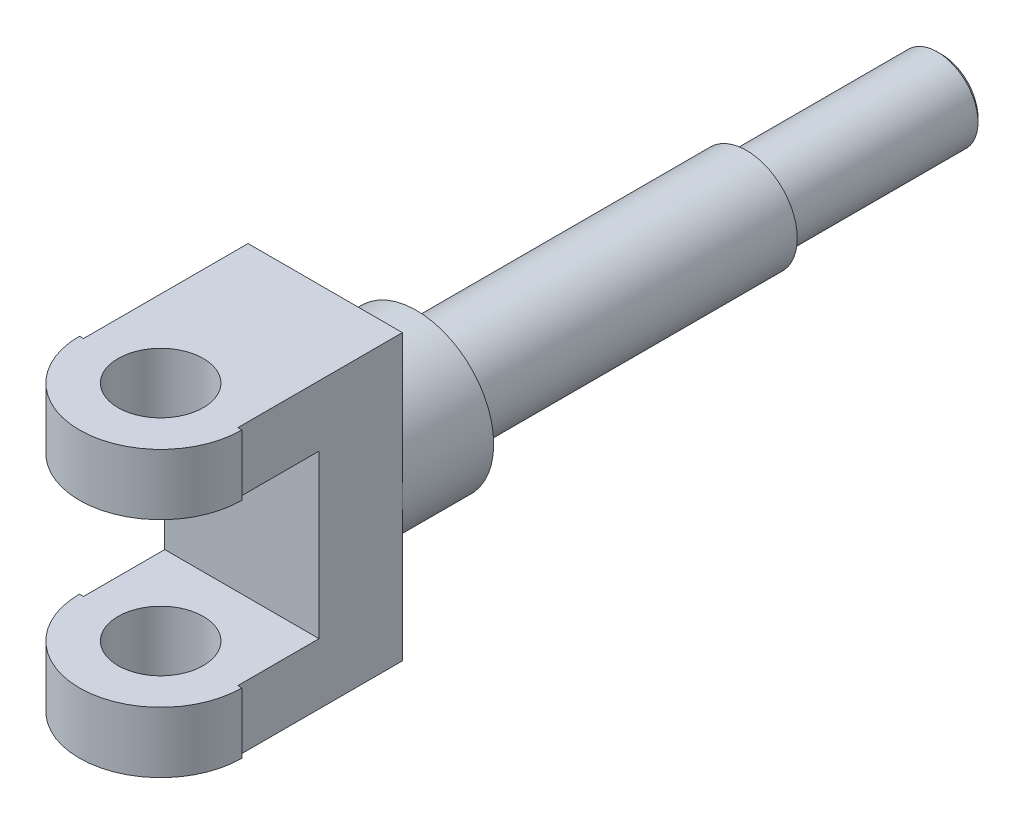
ISO-10303-21;
HEADER;
FILE_DESCRIPTION(('STEP AP214'),'2;1');
FILE_NAME('part.step','',(''),(''),'','','');
FILE_SCHEMA(('AUTOMOTIVE_DESIGN { 1 0 10303 214 1 1 1 1 }'));
ENDSEC;
DATA;
#1=APPLICATION_CONTEXT('core data for automotive mechanical design processes');
#2=APPLICATION_PROTOCOL_DEFINITION('international standard','automotive_design',2000,#1);
#3=PRODUCT_CONTEXT('',#1,'mechanical');
#4=PRODUCT('Part','Part','',(#3));
#5=PRODUCT_RELATED_PRODUCT_CATEGORY('part','',(#4));
#6=PRODUCT_DEFINITION_FORMATION('','',#4);
#7=PRODUCT_DEFINITION_CONTEXT('part definition',#1,'design');
#8=PRODUCT_DEFINITION('design','',#6,#7);
#9=PRODUCT_DEFINITION_SHAPE('','',#8);
#10=(LENGTH_UNIT() NAMED_UNIT(*) SI_UNIT(.MILLI.,.METRE.));
#11=(NAMED_UNIT(*) PLANE_ANGLE_UNIT() SI_UNIT($,.RADIAN.));
#12=(NAMED_UNIT(*) SI_UNIT($,.STERADIAN.) SOLID_ANGLE_UNIT());
#13=UNCERTAINTY_MEASURE_WITH_UNIT(LENGTH_MEASURE(1.E-05),#10,'distance_accuracy_value','');
#14=(GEOMETRIC_REPRESENTATION_CONTEXT(3) GLOBAL_UNCERTAINTY_ASSIGNED_CONTEXT((#13)) GLOBAL_UNIT_ASSIGNED_CONTEXT((#10,
#11,#12)) REPRESENTATION_CONTEXT('',''));
#15=CARTESIAN_POINT('',(0.,0.,0.));
#16=DIRECTION('',(0.,0.,1.));
#17=DIRECTION('',(1.,0.,0.));
#18=AXIS2_PLACEMENT_3D('',#15,#16,#17);
#19=CARTESIAN_POINT('',(0.,-35.001,192.25));
#20=DIRECTION('',(0.,1.,0.));
#21=DIRECTION('',(0.,0.,1.));
#22=AXIS2_PLACEMENT_3D('',#19,#20,#21);
#23=CYLINDRICAL_SURFACE('',#22,10.5);
#24=CARTESIAN_POINT('',(0.,35.,192.25));
#25=DIRECTION('',(0.,1.,0.));
#26=DIRECTION('',(0.,0.,-1.));
#27=AXIS2_PLACEMENT_3D('',#24,#25,#26);
#28=CIRCLE('',#27,10.5);
#29=CARTESIAN_POINT('',(0.,35.,181.75));
#30=VERTEX_POINT('',#29);
#31=EDGE_CURVE('E218',#30,#30,#28,.T.);
#32=ORIENTED_EDGE('',*,*,#31,.T.);
#33=EDGE_LOOP('',(#32));
#34=FACE_BOUND('',#33,.T.);
#35=CARTESIAN_POINT('',(0.,20.,192.25));
#36=DIRECTION('',(0.,-1.,0.));
#37=DIRECTION('',(0.,0.,1.));
#38=AXIS2_PLACEMENT_3D('',#35,#36,#37);
#39=CIRCLE('',#38,10.5);
#40=CARTESIAN_POINT('',(0.,20.,202.75));
#41=VERTEX_POINT('',#40);
#42=EDGE_CURVE('E187',#41,#41,#39,.T.);
#43=ORIENTED_EDGE('',*,*,#42,.T.);
#44=EDGE_LOOP('',(#43));
#45=FACE_BOUND('',#44,.T.);
#46=ADVANCED_FACE('F39',(#34,#45),#23,.F.);
#47=CARTESIAN_POINT('',(0.,0.,48.));
#48=DIRECTION('',(0.,0.,-1.));
#49=DIRECTION('',(-1.,0.,0.));
#50=AXIS2_PLACEMENT_3D('',#47,#48,#49);
#51=CYLINDRICAL_SURFACE('',#50,10.);
#52=CARTESIAN_POINT('',(0.,0.,1.));
#53=DIRECTION('',(0.,0.,1.));
#54=DIRECTION('',(1.,0.,0.));
#55=AXIS2_PLACEMENT_3D('',#52,#53,#54);
#56=CIRCLE('',#55,10.);
#57=CARTESIAN_POINT('',(10.,0.,1.));
#58=VERTEX_POINT('',#57);
#59=EDGE_CURVE('E260',#58,#58,#56,.T.);
#60=ORIENTED_EDGE('',*,*,#59,.T.);
#61=EDGE_LOOP('',(#60));
#62=FACE_BOUND('',#61,.T.);
#63=CARTESIAN_POINT('',(0.,0.,48.));
#64=DIRECTION('',(0.,0.,1.));
#65=DIRECTION('',(1.,0.,0.));
#66=AXIS2_PLACEMENT_3D('',#63,#64,#65);
#67=CIRCLE('',#66,10.);
#68=CARTESIAN_POINT('',(10.,0.,48.));
#69=VERTEX_POINT('',#68);
#70=EDGE_CURVE('E255',#69,#69,#67,.T.);
#71=ORIENTED_EDGE('',*,*,#70,.F.);
#72=EDGE_LOOP('',(#71));
#73=FACE_BOUND('',#72,.T.);
#74=ADVANCED_FACE('F326',(#62,#73),#51,.T.);
#75=CARTESIAN_POINT('',(0.,0.,0.));
#76=DIRECTION('',(0.,0.,1.));
#77=DIRECTION('',(1.,0.,0.));
#78=AXIS2_PLACEMENT_3D('',#75,#76,#77);
#79=PLANE('',#78);
#80=CARTESIAN_POINT('',(0.,0.,0.));
#81=DIRECTION('',(0.,0.,1.));
#82=DIRECTION('',(1.,0.,0.));
#83=AXIS2_PLACEMENT_3D('',#80,#81,#82);
#84=CIRCLE('',#83,8.99999999999999);
#85=CARTESIAN_POINT('',(8.99999999999999,0.,0.));
#86=VERTEX_POINT('',#85);
#87=EDGE_CURVE('E263',#86,#86,#84,.F.);
#88=ORIENTED_EDGE('',*,*,#87,.T.);
#89=EDGE_LOOP('',(#88));
#90=FACE_BOUND('',#89,.T.);
#91=ADVANCED_FACE('F333',(#90),#79,.F.);
#92=CARTESIAN_POINT('',(0.,0.,129.25));
#93=DIRECTION('',(0.,0.,-1.));
#94=DIRECTION('',(-1.,0.,0.));
#95=AXIS2_PLACEMENT_3D('',#92,#93,#94);
#96=CYLINDRICAL_SURFACE('',#95,12.5);
#97=CARTESIAN_POINT('',(0.,0.,129.25));
#98=DIRECTION('',(0.,0.,1.));
#99=DIRECTION('',(1.,0.,0.));
#100=AXIS2_PLACEMENT_3D('',#97,#98,#99);
#101=CIRCLE('',#100,12.5);
#102=CARTESIAN_POINT('',(12.5,0.,129.25));
#103=VERTEX_POINT('',#102);
#104=EDGE_CURVE('E252',#103,#103,#101,.T.);
#105=ORIENTED_EDGE('',*,*,#104,.F.);
#106=EDGE_LOOP('',(#105));
#107=FACE_BOUND('',#106,.T.);
#108=CARTESIAN_POINT('',(0.,0.,48.));
#109=DIRECTION('',(0.,0.,1.));
#110=DIRECTION('',(1.,0.,0.));
#111=AXIS2_PLACEMENT_3D('',#108,#109,#110);
#112=CIRCLE('',#111,12.5);
#113=CARTESIAN_POINT('',(12.5,0.,48.));
#114=VERTEX_POINT('',#113);
#115=EDGE_CURVE('E251',#114,#114,#112,.T.);
#116=ORIENTED_EDGE('',*,*,#115,.T.);
#117=EDGE_LOOP('',(#116));
#118=FACE_BOUND('',#117,.T.);
#119=ADVANCED_FACE('F369',(#107,#118),#96,.T.);
#120=CARTESIAN_POINT('',(0.,0.,48.));
#121=DIRECTION('',(0.,0.,1.));
#122=DIRECTION('',(1.,0.,0.));
#123=AXIS2_PLACEMENT_3D('',#120,#121,#122);
#124=PLANE('',#123);
#125=ORIENTED_EDGE('',*,*,#70,.T.);
#126=EDGE_LOOP('',(#125));
#127=FACE_BOUND('',#126,.T.);
#128=ORIENTED_EDGE('',*,*,#115,.F.);
#129=EDGE_LOOP('',(#128));
#130=FACE_BOUND('',#129,.T.);
#131=ADVANCED_FACE('F366',(#127,#130),#124,.F.);
#132=CARTESIAN_POINT('',(0.,0.,1.));
#133=DIRECTION('',(0.,0.,1.));
#134=DIRECTION('',(1.,0.,0.));
#135=AXIS2_PLACEMENT_3D('',#132,#133,#134);
#136=CONICAL_SURFACE('',#135,10.,0.78539816339745);
#137=ORIENTED_EDGE('',*,*,#87,.F.);
#138=EDGE_LOOP('',(#137));
#139=FACE_BOUND('',#138,.T.);
#140=ORIENTED_EDGE('',*,*,#59,.F.);
#141=EDGE_LOOP('',(#140));
#142=FACE_BOUND('',#141,.T.);
#143=ADVANCED_FACE('F42',(#139,#142),#136,.T.);
#144=CARTESIAN_POINT('',(0.,0.,189.25));
#145=DIRECTION('',(0.,0.,-1.));
#146=DIRECTION('',(-1.,0.,0.));
#147=AXIS2_PLACEMENT_3D('',#144,#145,#146);
#148=CYLINDRICAL_SURFACE('',#147,19.);
#149=CARTESIAN_POINT('',(0.,0.,151.73039646474));
#150=DIRECTION('',(0.,0.,-1.));
#151=DIRECTION('',(-1.,0.,0.));
#152=AXIS2_PLACEMENT_3D('',#149,#150,#151);
#153=CIRCLE('',#152,19.);
#154=CARTESIAN_POINT('',(19.,0.,151.73039646474));
#155=VERTEX_POINT('',#154);
#156=CARTESIAN_POINT('',(-19.,0.,151.73039646474));
#157=VERTEX_POINT('',#156);
#158=EDGE_CURVE('E60',#155,#157,#153,.T.);
#159=ORIENTED_EDGE('',*,*,#158,.T.);
#160=EDGE_CURVE('E48',#157,#155,#153,.T.);
#161=ORIENTED_EDGE('',*,*,#160,.T.);
#162=EDGE_LOOP('',(#159,#161));
#163=FACE_BOUND('',#162,.T.);
#164=CARTESIAN_POINT('',(0.,0.,129.25));
#165=DIRECTION('',(0.,0.,1.));
#166=DIRECTION('',(1.,0.,0.));
#167=AXIS2_PLACEMENT_3D('',#164,#165,#166);
#168=CIRCLE('',#167,19.);
#169=CARTESIAN_POINT('',(19.,0.,129.25));
#170=VERTEX_POINT('',#169);
#171=EDGE_CURVE('E240',#170,#170,#168,.T.);
#172=ORIENTED_EDGE('',*,*,#171,.T.);
#173=EDGE_LOOP('',(#172));
#174=FACE_BOUND('',#173,.T.);
#175=ADVANCED_FACE('F268',(#163,#174),#148,.T.);
#176=CARTESIAN_POINT('',(0.,0.,129.25));
#177=DIRECTION('',(0.,0.,1.));
#178=DIRECTION('',(1.,0.,0.));
#179=AXIS2_PLACEMENT_3D('',#176,#177,#178);
#180=PLANE('',#179);
#181=ORIENTED_EDGE('',*,*,#104,.T.);
#182=EDGE_LOOP('',(#181));
#183=FACE_BOUND('',#182,.T.);
#184=ORIENTED_EDGE('',*,*,#171,.F.);
#185=EDGE_LOOP('',(#184));
#186=FACE_BOUND('',#185,.T.);
#187=ADVANCED_FACE('F360',(#183,#186),#180,.F.);
#188=CARTESIAN_POINT('',(-19.,-35.,151.73039646474));
#189=DIRECTION('',(0.,0.,-1.));
#190=DIRECTION('',(-1.,0.,0.));
#191=AXIS2_PLACEMENT_3D('',#188,#189,#190);
#192=PLANE('',#191);
#193=ORIENTED_EDGE('',*,*,#160,.F.);
#194=DIRECTION('',(0.,1.,0.));
#195=VECTOR('',#194,1.);
#196=CARTESIAN_POINT('',(-19.,-35.,151.73039646474));
#197=LINE('',#196,#195);
#198=CARTESIAN_POINT('',(-19.,35.,151.73039646474));
#199=VERTEX_POINT('',#198);
#200=EDGE_CURVE('E241',#157,#199,#197,.T.);
#201=ORIENTED_EDGE('',*,*,#200,.T.);
#202=DIRECTION('',(-1.,0.,0.));
#203=VECTOR('',#202,1.);
#204=CARTESIAN_POINT('',(-19.,35.,151.73039646474));
#205=LINE('',#204,#203);
#206=CARTESIAN_POINT('',(19.,35.,151.73039646474));
#207=VERTEX_POINT('',#206);
#208=EDGE_CURVE('E227',#207,#199,#205,.T.);
#209=ORIENTED_EDGE('',*,*,#208,.F.);
#210=DIRECTION('',(0.,1.,0.));
#211=VECTOR('',#210,1.);
#212=CARTESIAN_POINT('',(19.,-35.,151.73039646474));
#213=LINE('',#212,#211);
#214=EDGE_CURVE('E245',#155,#207,#213,.T.);
#215=ORIENTED_EDGE('',*,*,#214,.F.);
#216=EDGE_LOOP('',(#193,#201,#209,#215));
#217=FACE_BOUND('',#216,.T.);
#218=ADVANCED_FACE('F271',(#217),#192,.T.);
#219=CARTESIAN_POINT('',(-19.,-35.,151.73039646474));
#220=DIRECTION('',(-1.,0.,0.));
#221=DIRECTION('',(0.,0.,1.));
#222=AXIS2_PLACEMENT_3D('',#219,#220,#221);
#223=PLANE('',#222);
#224=DIRECTION('',(0.,0.,1.));
#225=VECTOR('',#224,1.);
#226=CARTESIAN_POINT('',(-19.,20.,172.25));
#227=LINE('',#226,#225);
#228=CARTESIAN_POINT('',(-19.,20.,172.25));
#229=VERTEX_POINT('',#228);
#230=CARTESIAN_POINT('',(-19.,20.,192.25));
#231=VERTEX_POINT('',#230);
#232=EDGE_CURVE('E179',#229,#231,#227,.T.);
#233=ORIENTED_EDGE('',*,*,#232,.T.);
#234=DIRECTION('',(0.,-1.,0.));
#235=VECTOR('',#234,1.);
#236=CARTESIAN_POINT('',(-19.,-35.,192.25));
#237=LINE('',#236,#235);
#238=CARTESIAN_POINT('',(-19.,35.,192.25));
#239=VERTEX_POINT('',#238);
#240=EDGE_CURVE('E208',#239,#231,#237,.T.);
#241=ORIENTED_EDGE('',*,*,#240,.F.);
#242=DIRECTION('',(0.,0.,1.));
#243=VECTOR('',#242,1.);
#244=CARTESIAN_POINT('',(-19.,35.,151.73039646474));
#245=LINE('',#244,#243);
#246=EDGE_CURVE('E221',#199,#239,#245,.T.);
#247=ORIENTED_EDGE('',*,*,#246,.F.);
#248=ORIENTED_EDGE('',*,*,#200,.F.);
#249=CARTESIAN_POINT('',(-19.,-35.,151.73039646474));
#250=VERTEX_POINT('',#249);
#251=EDGE_CURVE('E55',#250,#157,#197,.T.);
#252=ORIENTED_EDGE('',*,*,#251,.F.);
#253=DIRECTION('',(0.,0.,1.));
#254=VECTOR('',#253,1.);
#255=CARTESIAN_POINT('',(-19.,-35.,151.73039646474));
#256=LINE('',#255,#254);
#257=CARTESIAN_POINT('',(-19.,-35.,192.25));
#258=VERTEX_POINT('',#257);
#259=EDGE_CURVE('E230',#250,#258,#256,.T.);
#260=ORIENTED_EDGE('',*,*,#259,.T.);
#261=DIRECTION('',(0.,1.,0.));
#262=VECTOR('',#261,1.);
#263=CARTESIAN_POINT('',(-19.,-35.,192.25));
#264=LINE('',#263,#262);
#265=CARTESIAN_POINT('',(-19.,-20.,192.25));
#266=VERTEX_POINT('',#265);
#267=EDGE_CURVE('E238',#258,#266,#264,.T.);
#268=ORIENTED_EDGE('',*,*,#267,.T.);
#269=DIRECTION('',(0.,0.,1.));
#270=VECTOR('',#269,1.);
#271=CARTESIAN_POINT('',(-19.,-20.,172.25));
#272=LINE('',#271,#270);
#273=CARTESIAN_POINT('',(-19.,-20.,172.25));
#274=VERTEX_POINT('',#273);
#275=EDGE_CURVE('E178',#274,#266,#272,.T.);
#276=ORIENTED_EDGE('',*,*,#275,.F.);
#277=DIRECTION('',(0.,-1.,0.));
#278=VECTOR('',#277,1.);
#279=CARTESIAN_POINT('',(-19.,20.,172.25));
#280=LINE('',#279,#278);
#281=EDGE_CURVE('E166',#229,#274,#280,.T.);
#282=ORIENTED_EDGE('',*,*,#281,.F.);
#283=EDGE_LOOP('',(#233,#241,#247,#248,#252,#260,#268,#276,#282));
#284=FACE_BOUND('',#283,.T.);
#285=ADVANCED_FACE('F285',(#284),#223,.T.);
#286=ORIENTED_EDGE('',*,*,#158,.F.);
#287=CARTESIAN_POINT('',(19.,-35.,151.73039646474));
#288=VERTEX_POINT('',#287);
#289=EDGE_CURVE('E242',#288,#155,#213,.T.);
#290=ORIENTED_EDGE('',*,*,#289,.F.);
#291=DIRECTION('',(-1.,0.,0.));
#292=VECTOR('',#291,1.);
#293=CARTESIAN_POINT('',(-19.,-35.,151.73039646474));
#294=LINE('',#293,#292);
#295=EDGE_CURVE('E236',#288,#250,#294,.T.);
#296=ORIENTED_EDGE('',*,*,#295,.T.);
#297=ORIENTED_EDGE('',*,*,#251,.T.);
#298=EDGE_LOOP('',(#286,#290,#296,#297));
#299=FACE_BOUND('',#298,.T.);
#300=ADVANCED_FACE('F279',(#299),#192,.T.);
#301=CARTESIAN_POINT('',(19.,-35.,151.73039646474));
#302=DIRECTION('',(1.,0.,0.));
#303=DIRECTION('',(0.,0.,-1.));
#304=AXIS2_PLACEMENT_3D('',#301,#302,#303);
#305=PLANE('',#304);
#306=DIRECTION('',(0.,0.,1.));
#307=VECTOR('',#306,1.);
#308=CARTESIAN_POINT('',(19.,20.,172.25));
#309=LINE('',#308,#307);
#310=CARTESIAN_POINT('',(19.,20.,172.25));
#311=VERTEX_POINT('',#310);
#312=CARTESIAN_POINT('',(19.,20.,192.25));
#313=VERTEX_POINT('',#312);
#314=EDGE_CURVE('E182',#311,#313,#309,.T.);
#315=ORIENTED_EDGE('',*,*,#314,.F.);
#316=DIRECTION('',(0.,1.,0.));
#317=VECTOR('',#316,1.);
#318=CARTESIAN_POINT('',(19.,20.,172.25));
#319=LINE('',#318,#317);
#320=CARTESIAN_POINT('',(19.,-20.,172.25));
#321=VERTEX_POINT('',#320);
#322=EDGE_CURVE('E173',#321,#311,#319,.T.);
#323=ORIENTED_EDGE('',*,*,#322,.F.);
#324=DIRECTION('',(0.,0.,1.));
#325=VECTOR('',#324,1.);
#326=CARTESIAN_POINT('',(19.,-20.,172.25));
#327=LINE('',#326,#325);
#328=CARTESIAN_POINT('',(19.,-20.,192.25));
#329=VERTEX_POINT('',#328);
#330=EDGE_CURVE('E184',#321,#329,#327,.T.);
#331=ORIENTED_EDGE('',*,*,#330,.T.);
#332=DIRECTION('',(0.,1.,0.));
#333=VECTOR('',#332,1.);
#334=CARTESIAN_POINT('',(19.,-35.,192.25));
#335=LINE('',#334,#333);
#336=CARTESIAN_POINT('',(19.,-35.,192.25));
#337=VERTEX_POINT('',#336);
#338=EDGE_CURVE('E156',#337,#329,#335,.T.);
#339=ORIENTED_EDGE('',*,*,#338,.F.);
#340=DIRECTION('',(0.,0.,-1.));
#341=VECTOR('',#340,1.);
#342=CARTESIAN_POINT('',(19.,-35.,151.73039646474));
#343=LINE('',#342,#341);
#344=EDGE_CURVE('E233',#337,#288,#343,.T.);
#345=ORIENTED_EDGE('',*,*,#344,.T.);
#346=ORIENTED_EDGE('',*,*,#289,.T.);
#347=ORIENTED_EDGE('',*,*,#214,.T.);
#348=DIRECTION('',(0.,0.,-1.));
#349=VECTOR('',#348,1.);
#350=CARTESIAN_POINT('',(19.,35.,151.73039646474));
#351=LINE('',#350,#349);
#352=CARTESIAN_POINT('',(19.,35.,192.25));
#353=VERTEX_POINT('',#352);
#354=EDGE_CURVE('E224',#353,#207,#351,.T.);
#355=ORIENTED_EDGE('',*,*,#354,.F.);
#356=DIRECTION('',(0.,1.,0.));
#357=VECTOR('',#356,1.);
#358=CARTESIAN_POINT('',(19.,-35.,192.25));
#359=LINE('',#358,#357);
#360=EDGE_CURVE('E213',#313,#353,#359,.T.);
#361=ORIENTED_EDGE('',*,*,#360,.F.);
#362=EDGE_LOOP('',(#315,#323,#331,#339,#345,#346,#347,#355,#361));
#363=FACE_BOUND('',#362,.T.);
#364=ADVANCED_FACE('F276',(#363),#305,.T.);
#365=CARTESIAN_POINT('',(0.,-35.,0.));
#366=DIRECTION('',(0.,1.,0.));
#367=DIRECTION('',(0.,0.,1.));
#368=AXIS2_PLACEMENT_3D('',#365,#366,#367);
#369=PLANE('',#368);
#370=CARTESIAN_POINT('',(0.,-35.,192.25));
#371=DIRECTION('',(0.,1.,0.));
#372=DIRECTION('',(0.,0.,1.));
#373=AXIS2_PLACEMENT_3D('',#370,#371,#372);
#374=CIRCLE('',#373,10.5);
#375=CARTESIAN_POINT('',(0.,-35.,202.75));
#376=VERTEX_POINT('',#375);
#377=EDGE_CURVE('E215',#376,#376,#374,.F.);
#378=ORIENTED_EDGE('',*,*,#377,.F.);
#379=EDGE_LOOP('',(#378));
#380=FACE_BOUND('',#379,.T.);
#381=ORIENTED_EDGE('',*,*,#344,.F.);
#382=DIRECTION('',(-1.,0.,0.));
#383=VECTOR('',#382,1.);
#384=CARTESIAN_POINT('',(10.5,-35.,192.25));
#385=LINE('',#384,#383);
#386=CARTESIAN_POINT('',(20.,-35.,192.25));
#387=VERTEX_POINT('',#386);
#388=EDGE_CURVE('E163',#387,#337,#385,.T.);
#389=ORIENTED_EDGE('',*,*,#388,.F.);
#390=CARTESIAN_POINT('',(0.,-35.,192.25));
#391=DIRECTION('',(0.,1.,0.));
#392=DIRECTION('',(0.,0.,-1.));
#393=AXIS2_PLACEMENT_3D('',#390,#391,#392);
#394=CIRCLE('',#393,20.);
#395=CARTESIAN_POINT('',(-20.,-35.,192.25));
#396=VERTEX_POINT('',#395);
#397=EDGE_CURVE('E149',#396,#387,#394,.T.);
#398=ORIENTED_EDGE('',*,*,#397,.F.);
#399=DIRECTION('',(-1.,0.,0.));
#400=VECTOR('',#399,1.);
#401=CARTESIAN_POINT('',(-20.,-35.,192.25));
#402=LINE('',#401,#400);
#403=EDGE_CURVE('E158',#258,#396,#402,.T.);
#404=ORIENTED_EDGE('',*,*,#403,.F.);
#405=ORIENTED_EDGE('',*,*,#259,.F.);
#406=ORIENTED_EDGE('',*,*,#295,.F.);
#407=EDGE_LOOP('',(#381,#389,#398,#404,#405,#406));
#408=FACE_BOUND('',#407,.T.);
#409=ADVANCED_FACE('F282',(#380,#408),#369,.F.);
#410=CARTESIAN_POINT('',(0.,35.,0.));
#411=DIRECTION('',(0.,1.,0.));
#412=DIRECTION('',(0.,0.,1.));
#413=AXIS2_PLACEMENT_3D('',#410,#411,#412);
#414=PLANE('',#413);
#415=DIRECTION('',(-1.,0.,0.));
#416=VECTOR('',#415,1.);
#417=CARTESIAN_POINT('',(10.5,35.,192.25));
#418=LINE('',#417,#416);
#419=CARTESIAN_POINT('',(20.,35.,192.25));
#420=VERTEX_POINT('',#419);
#421=EDGE_CURVE('E191',#420,#353,#418,.T.);
#422=ORIENTED_EDGE('',*,*,#421,.T.);
#423=ORIENTED_EDGE('',*,*,#354,.T.);
#424=ORIENTED_EDGE('',*,*,#208,.T.);
#425=ORIENTED_EDGE('',*,*,#246,.T.);
#426=DIRECTION('',(-1.,0.,0.));
#427=VECTOR('',#426,1.);
#428=CARTESIAN_POINT('',(-20.,35.,192.25));
#429=LINE('',#428,#427);
#430=CARTESIAN_POINT('',(-20.,35.,192.25));
#431=VERTEX_POINT('',#430);
#432=EDGE_CURVE('E181',#239,#431,#429,.T.);
#433=ORIENTED_EDGE('',*,*,#432,.T.);
#434=CARTESIAN_POINT('',(0.,35.,192.25));
#435=DIRECTION('',(0.,1.,0.));
#436=DIRECTION('',(0.,0.,-1.));
#437=AXIS2_PLACEMENT_3D('',#434,#435,#436);
#438=CIRCLE('',#437,20.);
#439=EDGE_CURVE('E201',#431,#420,#438,.T.);
#440=ORIENTED_EDGE('',*,*,#439,.T.);
#441=EDGE_LOOP('',(#422,#423,#424,#425,#433,#440));
#442=FACE_BOUND('',#441,.T.);
#443=ORIENTED_EDGE('',*,*,#31,.F.);
#444=EDGE_LOOP('',(#443));
#445=FACE_BOUND('',#444,.T.);
#446=ADVANCED_FACE('F290',(#442,#445),#414,.T.);
#447=CARTESIAN_POINT('',(0.,-20.,192.25));
#448=DIRECTION('',(0.,-1.,0.));
#449=DIRECTION('',(0.,0.,-1.));
#450=AXIS2_PLACEMENT_3D('',#447,#448,#449);
#451=CIRCLE('',#450,10.5);
#452=CARTESIAN_POINT('',(0.,-20.,181.75));
#453=VERTEX_POINT('',#452);
#454=EDGE_CURVE('E11',#453,#453,#451,.F.);
#455=ORIENTED_EDGE('',*,*,#454,.T.);
#456=EDGE_LOOP('',(#455));
#457=FACE_BOUND('',#456,.T.);
#458=ORIENTED_EDGE('',*,*,#377,.T.);
#459=EDGE_LOOP('',(#458));
#460=FACE_BOUND('',#459,.T.);
#461=ADVANCED_FACE('F329',(#457,#460),#23,.F.);
#462=CARTESIAN_POINT('',(10.5,20.,192.25));
#463=DIRECTION('',(0.,0.,-1.));
#464=DIRECTION('',(-1.,0.,0.));
#465=AXIS2_PLACEMENT_3D('',#462,#463,#464);
#466=PLANE('',#465);
#467=DIRECTION('',(-1.,0.,0.));
#468=VECTOR('',#467,1.);
#469=CARTESIAN_POINT('',(10.5,20.,192.25));
#470=LINE('',#469,#468);
#471=CARTESIAN_POINT('',(20.,20.,192.25));
#472=VERTEX_POINT('',#471);
#473=EDGE_CURVE('E196',#472,#313,#470,.T.);
#474=ORIENTED_EDGE('',*,*,#473,.T.);
#475=ORIENTED_EDGE('',*,*,#360,.T.);
#476=ORIENTED_EDGE('',*,*,#421,.F.);
#477=DIRECTION('',(0.,1.,0.));
#478=VECTOR('',#477,1.);
#479=CARTESIAN_POINT('',(20.,20.,192.25));
#480=LINE('',#479,#478);
#481=EDGE_CURVE('E206',#472,#420,#480,.T.);
#482=ORIENTED_EDGE('',*,*,#481,.F.);
#483=EDGE_LOOP('',(#474,#475,#476,#482));
#484=FACE_BOUND('',#483,.T.);
#485=ADVANCED_FACE('F302',(#484),#466,.T.);
#486=CARTESIAN_POINT('',(0.,20.,192.25));
#487=DIRECTION('',(0.,1.,0.));
#488=DIRECTION('',(0.,0.,1.));
#489=AXIS2_PLACEMENT_3D('',#486,#487,#488);
#490=CYLINDRICAL_SURFACE('',#489,20.);
#491=ORIENTED_EDGE('',*,*,#439,.F.);
#492=DIRECTION('',(0.,1.,0.));
#493=VECTOR('',#492,1.);
#494=CARTESIAN_POINT('',(-20.,20.,192.25));
#495=LINE('',#494,#493);
#496=CARTESIAN_POINT('',(-20.,20.,192.25));
#497=VERTEX_POINT('',#496);
#498=EDGE_CURVE('E199',#497,#431,#495,.T.);
#499=ORIENTED_EDGE('',*,*,#498,.F.);
#500=CARTESIAN_POINT('',(0.,20.,192.25));
#501=DIRECTION('',(0.,1.,0.));
#502=DIRECTION('',(0.,0.,-1.));
#503=AXIS2_PLACEMENT_3D('',#500,#501,#502);
#504=CIRCLE('',#503,20.);
#505=EDGE_CURVE('E193',#497,#472,#504,.T.);
#506=ORIENTED_EDGE('',*,*,#505,.T.);
#507=ORIENTED_EDGE('',*,*,#481,.T.);
#508=EDGE_LOOP('',(#491,#499,#506,#507));
#509=FACE_BOUND('',#508,.T.);
#510=ADVANCED_FACE('F299',(#509),#490,.T.);
#511=CARTESIAN_POINT('',(-20.,20.,192.25));
#512=DIRECTION('',(0.,0.,-1.));
#513=DIRECTION('',(-1.,0.,0.));
#514=AXIS2_PLACEMENT_3D('',#511,#512,#513);
#515=PLANE('',#514);
#516=ORIENTED_EDGE('',*,*,#432,.F.);
#517=ORIENTED_EDGE('',*,*,#240,.T.);
#518=DIRECTION('',(-1.,0.,0.));
#519=VECTOR('',#518,1.);
#520=CARTESIAN_POINT('',(-20.,20.,192.25));
#521=LINE('',#520,#519);
#522=EDGE_CURVE('E190',#231,#497,#521,.T.);
#523=ORIENTED_EDGE('',*,*,#522,.T.);
#524=ORIENTED_EDGE('',*,*,#498,.T.);
#525=EDGE_LOOP('',(#516,#517,#523,#524));
#526=FACE_BOUND('',#525,.T.);
#527=ADVANCED_FACE('F293',(#526),#515,.T.);
#528=CARTESIAN_POINT('',(0.,20.,192.25));
#529=DIRECTION('',(0.,1.,0.));
#530=DIRECTION('',(0.,0.,1.));
#531=AXIS2_PLACEMENT_3D('',#528,#529,#530);
#532=PLANE('',#531);
#533=ORIENTED_EDGE('',*,*,#522,.F.);
#534=ORIENTED_EDGE('',*,*,#232,.F.);
#535=DIRECTION('',(-1.,0.,0.));
#536=VECTOR('',#535,1.);
#537=CARTESIAN_POINT('',(-19.,20.,172.25));
#538=LINE('',#537,#536);
#539=EDGE_CURVE('E175',#311,#229,#538,.T.);
#540=ORIENTED_EDGE('',*,*,#539,.F.);
#541=ORIENTED_EDGE('',*,*,#314,.T.);
#542=ORIENTED_EDGE('',*,*,#473,.F.);
#543=ORIENTED_EDGE('',*,*,#505,.F.);
#544=EDGE_LOOP('',(#533,#534,#540,#541,#542,#543));
#545=FACE_BOUND('',#544,.T.);
#546=ORIENTED_EDGE('',*,*,#42,.F.);
#547=EDGE_LOOP('',(#546));
#548=FACE_BOUND('',#547,.T.);
#549=ADVANCED_FACE('F308',(#545,#548),#532,.F.);
#550=CARTESIAN_POINT('',(-19.,-20.,172.25));
#551=DIRECTION('',(0.,-1.,0.));
#552=DIRECTION('',(0.,0.,-1.));
#553=AXIS2_PLACEMENT_3D('',#550,#551,#552);
#554=PLANE('',#553);
#555=ORIENTED_EDGE('',*,*,#454,.F.);
#556=EDGE_LOOP('',(#555));
#557=FACE_BOUND('',#556,.T.);
#558=ORIENTED_EDGE('',*,*,#275,.T.);
#559=DIRECTION('',(-1.,0.,0.));
#560=VECTOR('',#559,1.);
#561=CARTESIAN_POINT('',(-20.,-20.,192.25));
#562=LINE('',#561,#560);
#563=CARTESIAN_POINT('',(-20.,-20.,192.25));
#564=VERTEX_POINT('',#563);
#565=EDGE_CURVE('E140',#266,#564,#562,.T.);
#566=ORIENTED_EDGE('',*,*,#565,.T.);
#567=CARTESIAN_POINT('',(0.,-20.,192.25));
#568=DIRECTION('',(0.,1.,0.));
#569=DIRECTION('',(0.,0.,-1.));
#570=AXIS2_PLACEMENT_3D('',#567,#568,#569);
#571=CIRCLE('',#570,20.);
#572=CARTESIAN_POINT('',(20.,-20.,192.25));
#573=VERTEX_POINT('',#572);
#574=EDGE_CURVE('E133',#564,#573,#571,.T.);
#575=ORIENTED_EDGE('',*,*,#574,.T.);
#576=DIRECTION('',(-1.,0.,0.));
#577=VECTOR('',#576,1.);
#578=CARTESIAN_POINT('',(10.5,-20.,192.25));
#579=LINE('',#578,#577);
#580=EDGE_CURVE('E138',#573,#329,#579,.T.);
#581=ORIENTED_EDGE('',*,*,#580,.T.);
#582=ORIENTED_EDGE('',*,*,#330,.F.);
#583=DIRECTION('',(1.,0.,0.));
#584=VECTOR('',#583,1.);
#585=CARTESIAN_POINT('',(-19.,-20.,172.25));
#586=LINE('',#585,#584);
#587=EDGE_CURVE('E170',#274,#321,#586,.T.);
#588=ORIENTED_EDGE('',*,*,#587,.F.);
#589=EDGE_LOOP('',(#558,#566,#575,#581,#582,#588));
#590=FACE_BOUND('',#589,.T.);
#591=ADVANCED_FACE('F136',(#557,#590),#554,.F.);
#592=CARTESIAN_POINT('',(0.,0.,172.25));
#593=DIRECTION('',(0.,0.,1.));
#594=DIRECTION('',(1.,0.,0.));
#595=AXIS2_PLACEMENT_3D('',#592,#593,#594);
#596=PLANE('',#595);
#597=ORIENTED_EDGE('',*,*,#281,.T.);
#598=ORIENTED_EDGE('',*,*,#587,.T.);
#599=ORIENTED_EDGE('',*,*,#322,.T.);
#600=ORIENTED_EDGE('',*,*,#539,.T.);
#601=EDGE_LOOP('',(#597,#598,#599,#600));
#602=FACE_BOUND('',#601,.T.);
#603=ADVANCED_FACE('F312',(#602),#596,.T.);
#604=CARTESIAN_POINT('',(-20.,-20.,192.25));
#605=DIRECTION('',(0.,0.,1.));
#606=DIRECTION('',(1.,0.,0.));
#607=AXIS2_PLACEMENT_3D('',#604,#605,#606);
#608=PLANE('',#607);
#609=ORIENTED_EDGE('',*,*,#267,.F.);
#610=ORIENTED_EDGE('',*,*,#403,.T.);
#611=DIRECTION('',(0.,-1.,0.));
#612=VECTOR('',#611,1.);
#613=CARTESIAN_POINT('',(-20.,-20.,192.25));
#614=LINE('',#613,#612);
#615=EDGE_CURVE('E152',#564,#396,#614,.T.);
#616=ORIENTED_EDGE('',*,*,#615,.F.);
#617=ORIENTED_EDGE('',*,*,#565,.F.);
#618=EDGE_LOOP('',(#609,#610,#616,#617));
#619=FACE_BOUND('',#618,.T.);
#620=ADVANCED_FACE('F314',(#619),#608,.F.);
#621=CARTESIAN_POINT('',(0.,-20.,192.25));
#622=DIRECTION('',(0.,-1.,0.));
#623=DIRECTION('',(0.,0.,-1.));
#624=AXIS2_PLACEMENT_3D('',#621,#622,#623);
#625=CYLINDRICAL_SURFACE('',#624,20.);
#626=ORIENTED_EDGE('',*,*,#397,.T.);
#627=DIRECTION('',(0.,-1.,0.));
#628=VECTOR('',#627,1.);
#629=CARTESIAN_POINT('',(20.,-20.,192.25));
#630=LINE('',#629,#628);
#631=EDGE_CURVE('E146',#573,#387,#630,.T.);
#632=ORIENTED_EDGE('',*,*,#631,.F.);
#633=ORIENTED_EDGE('',*,*,#574,.F.);
#634=ORIENTED_EDGE('',*,*,#615,.T.);
#635=EDGE_LOOP('',(#626,#632,#633,#634));
#636=FACE_BOUND('',#635,.T.);
#637=ADVANCED_FACE('F147',(#636),#625,.T.);
#638=CARTESIAN_POINT('',(10.5,-20.,192.25));
#639=DIRECTION('',(0.,0.,1.));
#640=DIRECTION('',(1.,0.,0.));
#641=AXIS2_PLACEMENT_3D('',#638,#639,#640);
#642=PLANE('',#641);
#643=ORIENTED_EDGE('',*,*,#338,.T.);
#644=ORIENTED_EDGE('',*,*,#580,.F.);
#645=ORIENTED_EDGE('',*,*,#631,.T.);
#646=ORIENTED_EDGE('',*,*,#388,.T.);
#647=EDGE_LOOP('',(#643,#644,#645,#646));
#648=FACE_BOUND('',#647,.T.);
#649=ADVANCED_FACE('F154',(#648),#642,.F.);
#650=CLOSED_SHELL('',(#46,#74,#91,#119,#131,#143,#175,#187,#218,#285,#300,#364,#409,#446,#461,
#485,#510,#527,#549,#591,#603,#620,#637,#649));
#651=MANIFOLD_SOLID_BREP('B2',#650);
#652=ADVANCED_BREP_SHAPE_REPRESENTATION('',(#18,#651),#14);
#653=SHAPE_DEFINITION_REPRESENTATION(#9,#652);
ENDSEC;
END-ISO-10303-21;
